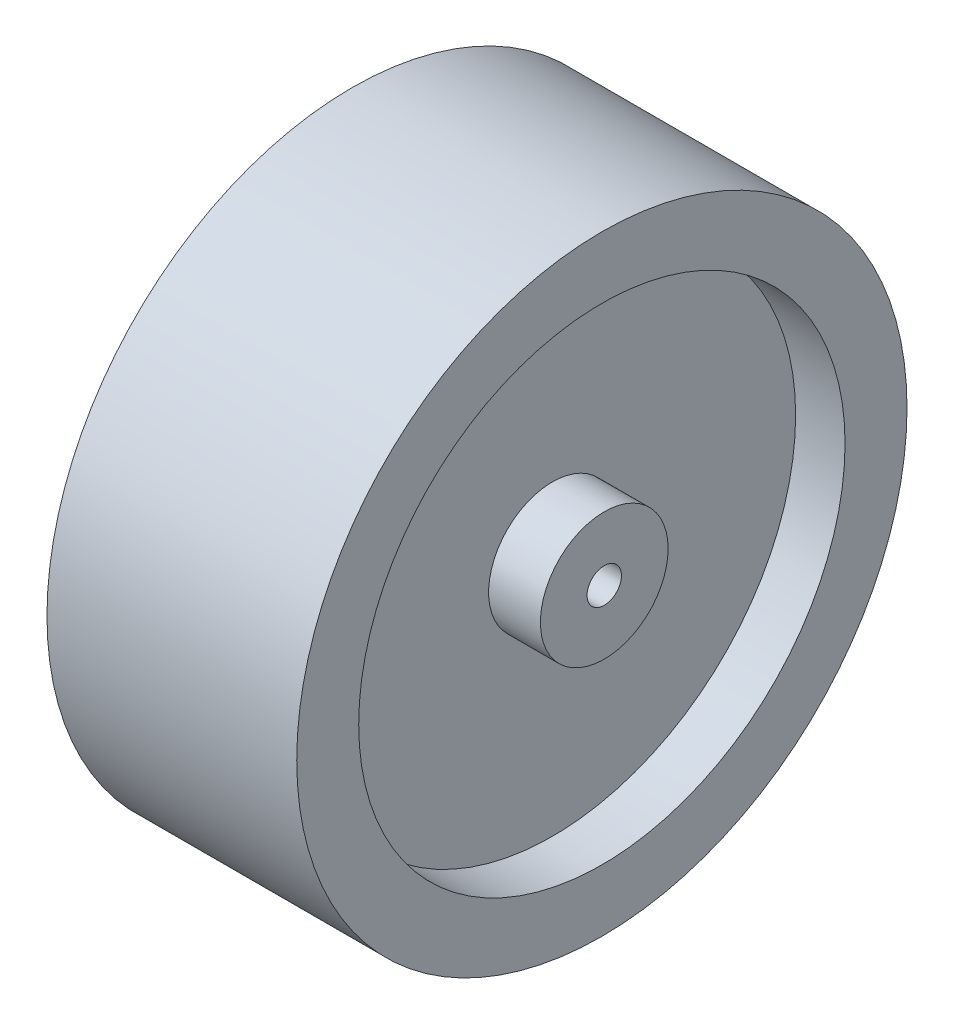
ISO-10303-21;
HEADER;
FILE_DESCRIPTION(('STEP AP214'),'2;1');
FILE_NAME('part.step','',(''),(''),'','','');
FILE_SCHEMA(('AUTOMOTIVE_DESIGN { 1 0 10303 214 1 1 1 1 }'));
ENDSEC;
DATA;
#1=APPLICATION_CONTEXT('core data for automotive mechanical design processes');
#2=APPLICATION_PROTOCOL_DEFINITION('international standard','automotive_design',2000,#1);
#3=PRODUCT_CONTEXT('',#1,'mechanical');
#4=PRODUCT('Part','Part','',(#3));
#5=PRODUCT_RELATED_PRODUCT_CATEGORY('part','',(#4));
#6=PRODUCT_DEFINITION_FORMATION('','',#4);
#7=PRODUCT_DEFINITION_CONTEXT('part definition',#1,'design');
#8=PRODUCT_DEFINITION('design','',#6,#7);
#9=PRODUCT_DEFINITION_SHAPE('','',#8);
#10=(LENGTH_UNIT() NAMED_UNIT(*) SI_UNIT(.MILLI.,.METRE.));
#11=(NAMED_UNIT(*) PLANE_ANGLE_UNIT() SI_UNIT($,.RADIAN.));
#12=(NAMED_UNIT(*) SI_UNIT($,.STERADIAN.) SOLID_ANGLE_UNIT());
#13=UNCERTAINTY_MEASURE_WITH_UNIT(LENGTH_MEASURE(1.E-05),#10,'distance_accuracy_value','');
#14=(GEOMETRIC_REPRESENTATION_CONTEXT(3) GLOBAL_UNCERTAINTY_ASSIGNED_CONTEXT((#13)) GLOBAL_UNIT_ASSIGNED_CONTEXT((#10,
#11,#12)) REPRESENTATION_CONTEXT('',''));
#15=CARTESIAN_POINT('',(0.,0.,0.));
#16=DIRECTION('',(0.,0.,1.));
#17=DIRECTION('',(1.,0.,0.));
#18=AXIS2_PLACEMENT_3D('',#15,#16,#17);
#19=CARTESIAN_POINT('',(20.7200849919368,0.,0.));
#20=DIRECTION('',(-1.,0.,0.));
#21=DIRECTION('',(0.,0.,1.));
#22=AXIS2_PLACEMENT_3D('',#19,#20,#21);
#23=CYLINDRICAL_SURFACE('',#22,16.64);
#24=CARTESIAN_POINT('',(20.7200849919368,0.,0.));
#25=DIRECTION('',(1.,0.,0.));
#26=DIRECTION('',(0.,0.,-1.));
#27=AXIS2_PLACEMENT_3D('',#24,#25,#26);
#28=CIRCLE('',#27,16.64);
#29=CARTESIAN_POINT('',(20.7200849919368,0.,-16.64));
#30=VERTEX_POINT('',#29);
#31=EDGE_CURVE('E10',#30,#30,#28,.T.);
#32=ORIENTED_EDGE('',*,*,#31,.F.);
#33=EDGE_LOOP('',(#32));
#34=FACE_BOUND('',#33,.T.);
#35=CARTESIAN_POINT('',(7.10088499193683,0.,0.));
#36=DIRECTION('',(1.,0.,0.));
#37=DIRECTION('',(0.,0.,-1.));
#38=AXIS2_PLACEMENT_3D('',#35,#36,#37);
#39=CIRCLE('',#38,16.64);
#40=CARTESIAN_POINT('',(7.10088499193683,0.,-16.64));
#41=VERTEX_POINT('',#40);
#42=EDGE_CURVE('E46',#41,#41,#39,.T.);
#43=ORIENTED_EDGE('',*,*,#42,.T.);
#44=EDGE_LOOP('',(#43));
#45=FACE_BOUND('',#44,.T.);
#46=ADVANCED_FACE('F38',(#34,#45),#23,.T.);
#47=CARTESIAN_POINT('',(20.7200849919368,0.,0.));
#48=DIRECTION('',(1.,0.,0.));
#49=DIRECTION('',(0.,0.,-1.));
#50=AXIS2_PLACEMENT_3D('',#47,#48,#49);
#51=PLANE('',#50);
#52=CARTESIAN_POINT('',(20.7200849919368,0.,0.));
#53=DIRECTION('',(1.,0.,0.));
#54=DIRECTION('',(0.,0.,-1.));
#55=AXIS2_PLACEMENT_3D('',#52,#53,#54);
#56=CIRCLE('',#55,13.2608);
#57=CARTESIAN_POINT('',(20.7200849919368,0.,-13.2608));
#58=VERTEX_POINT('',#57);
#59=EDGE_CURVE('E54',#58,#58,#56,.T.);
#60=ORIENTED_EDGE('',*,*,#59,.F.);
#61=EDGE_LOOP('',(#60));
#62=FACE_BOUND('',#61,.T.);
#63=ORIENTED_EDGE('',*,*,#31,.T.);
#64=EDGE_LOOP('',(#63));
#65=FACE_BOUND('',#64,.T.);
#66=ADVANCED_FACE('F107',(#62,#65),#51,.T.);
#67=CARTESIAN_POINT('',(7.10088499193683,0.,0.));
#68=DIRECTION('',(1.,0.,0.));
#69=DIRECTION('',(0.,0.,-1.));
#70=AXIS2_PLACEMENT_3D('',#67,#68,#69);
#71=PLANE('',#70);
#72=CARTESIAN_POINT('',(7.10088499193683,0.,0.));
#73=DIRECTION('',(-1.,0.,0.));
#74=DIRECTION('',(0.,0.,1.));
#75=AXIS2_PLACEMENT_3D('',#72,#73,#74);
#76=CIRCLE('',#75,13.2608);
#77=CARTESIAN_POINT('',(7.10088499193683,0.,13.2608));
#78=VERTEX_POINT('',#77);
#79=EDGE_CURVE('E62',#78,#78,#76,.T.);
#80=ORIENTED_EDGE('',*,*,#79,.F.);
#81=EDGE_LOOP('',(#80));
#82=FACE_BOUND('',#81,.T.);
#83=ORIENTED_EDGE('',*,*,#42,.F.);
#84=EDGE_LOOP('',(#83));
#85=FACE_BOUND('',#84,.T.);
#86=ADVANCED_FACE('F112',(#82,#85),#71,.F.);
#87=CARTESIAN_POINT('',(18.0249169919368,0.,0.));
#88=DIRECTION('',(1.,0.,0.));
#89=DIRECTION('',(0.,0.,-1.));
#90=AXIS2_PLACEMENT_3D('',#87,#88,#89);
#91=CYLINDRICAL_SURFACE('',#90,13.2608);
#92=CARTESIAN_POINT('',(18.0249169919368,0.,0.));
#93=DIRECTION('',(1.,0.,0.));
#94=DIRECTION('',(0.,0.,-1.));
#95=AXIS2_PLACEMENT_3D('',#92,#93,#94);
#96=CIRCLE('',#95,13.2608);
#97=CARTESIAN_POINT('',(18.0249169919368,0.,-13.2608));
#98=VERTEX_POINT('',#97);
#99=EDGE_CURVE('E52',#98,#98,#96,.T.);
#100=ORIENTED_EDGE('',*,*,#99,.F.);
#101=EDGE_LOOP('',(#100));
#102=FACE_BOUND('',#101,.T.);
#103=ORIENTED_EDGE('',*,*,#59,.T.);
#104=EDGE_LOOP('',(#103));
#105=FACE_BOUND('',#104,.T.);
#106=ADVANCED_FACE('F119',(#102,#105),#91,.F.);
#107=CARTESIAN_POINT('',(18.0249169919368,0.,0.));
#108=DIRECTION('',(1.,0.,0.));
#109=DIRECTION('',(0.,0.,-1.));
#110=AXIS2_PLACEMENT_3D('',#107,#108,#109);
#111=PLANE('',#110);
#112=CARTESIAN_POINT('',(18.0249169919368,0.,0.));
#113=DIRECTION('',(1.,0.,0.));
#114=DIRECTION('',(0.,0.,-1.));
#115=AXIS2_PLACEMENT_3D('',#112,#113,#114);
#116=CIRCLE('',#115,3.4816);
#117=CARTESIAN_POINT('',(18.0249169919368,0.,-3.4816));
#118=VERTEX_POINT('',#117);
#119=EDGE_CURVE('E78',#118,#118,#116,.T.);
#120=ORIENTED_EDGE('',*,*,#119,.F.);
#121=EDGE_LOOP('',(#120));
#122=FACE_BOUND('',#121,.T.);
#123=ORIENTED_EDGE('',*,*,#99,.T.);
#124=EDGE_LOOP('',(#123));
#125=FACE_BOUND('',#124,.T.);
#126=ADVANCED_FACE('F124',(#122,#125),#111,.T.);
#127=CARTESIAN_POINT('',(14.0876369919368,0.,0.));
#128=DIRECTION('',(-1.,0.,0.));
#129=DIRECTION('',(0.,0.,1.));
#130=AXIS2_PLACEMENT_3D('',#127,#128,#129);
#131=CYLINDRICAL_SURFACE('',#130,13.2608);
#132=CARTESIAN_POINT('',(14.0876369919368,0.,0.));
#133=DIRECTION('',(-1.,0.,0.));
#134=DIRECTION('',(0.,0.,1.));
#135=AXIS2_PLACEMENT_3D('',#132,#133,#134);
#136=CIRCLE('',#135,13.2608);
#137=CARTESIAN_POINT('',(14.0876369919368,0.,13.2608));
#138=VERTEX_POINT('',#137);
#139=EDGE_CURVE('E58',#138,#138,#136,.T.);
#140=CARTESIAN_POINT('',(14.0876369919368,0.,13.2608));
#141=CARTESIAN_POINT('',(14.0148583252702,0.,13.2608));
#142=CARTESIAN_POINT('',(13.9420796586035,0.,13.2608));
#143=CARTESIAN_POINT('',(13.7965223252702,0.,13.2608));
#144=CARTESIAN_POINT('',(13.7237436586035,0.,13.2608));
#145=CARTESIAN_POINT('',(13.5781863252702,0.,13.2608));
#146=CARTESIAN_POINT('',(13.5054076586035,0.,13.2608));
#147=CARTESIAN_POINT('',(13.3598503252702,0.,13.2608));
#148=CARTESIAN_POINT('',(13.2870716586035,0.,13.2608));
#149=CARTESIAN_POINT('',(13.1415143252702,0.,13.2608));
#150=CARTESIAN_POINT('',(13.0687356586035,0.,13.2608));
#151=CARTESIAN_POINT('',(12.9231783252702,0.,13.2608));
#152=CARTESIAN_POINT('',(12.8503996586035,0.,13.2608));
#153=CARTESIAN_POINT('',(12.7048423252702,0.,13.2608));
#154=CARTESIAN_POINT('',(12.6320636586035,0.,13.2608));
#155=CARTESIAN_POINT('',(12.4865063252702,0.,13.2608));
#156=CARTESIAN_POINT('',(12.4137276586035,0.,13.2608));
#157=CARTESIAN_POINT('',(12.2681703252702,0.,13.2608));
#158=CARTESIAN_POINT('',(12.1953916586035,0.,13.2608));
#159=CARTESIAN_POINT('',(12.0498343252702,0.,13.2608));
#160=CARTESIAN_POINT('',(11.9770556586035,0.,13.2608));
#161=CARTESIAN_POINT('',(11.8314983252702,0.,13.2608));
#162=CARTESIAN_POINT('',(11.7587196586035,0.,13.2608));
#163=CARTESIAN_POINT('',(11.6131623252702,0.,13.2608));
#164=CARTESIAN_POINT('',(11.5403836586035,0.,13.2608));
#165=CARTESIAN_POINT('',(11.3948263252702,0.,13.2608));
#166=CARTESIAN_POINT('',(11.3220476586035,0.,13.2608));
#167=CARTESIAN_POINT('',(11.1764903252702,0.,13.2608));
#168=CARTESIAN_POINT('',(11.1037116586035,0.,13.2608));
#169=CARTESIAN_POINT('',(10.9581543252702,0.,13.2608));
#170=CARTESIAN_POINT('',(10.8853756586035,0.,13.2608));
#171=CARTESIAN_POINT('',(10.7398183252702,0.,13.2608));
#172=CARTESIAN_POINT('',(10.6670396586035,0.,13.2608));
#173=CARTESIAN_POINT('',(10.5214823252702,0.,13.2608));
#174=CARTESIAN_POINT('',(10.4487036586035,0.,13.2608));
#175=CARTESIAN_POINT('',(10.3031463252702,0.,13.2608));
#176=CARTESIAN_POINT('',(10.2303676586035,0.,13.2608));
#177=CARTESIAN_POINT('',(10.0848103252702,0.,13.2608));
#178=CARTESIAN_POINT('',(10.0120316586035,0.,13.2608));
#179=CARTESIAN_POINT('',(9.86647432527017,0.,13.2608));
#180=CARTESIAN_POINT('',(9.7936956586035,0.,13.2608));
#181=CARTESIAN_POINT('',(9.64813832527017,0.,13.2608));
#182=CARTESIAN_POINT('',(9.5753596586035,0.,13.2608));
#183=CARTESIAN_POINT('',(9.42980232527017,0.,13.2608));
#184=CARTESIAN_POINT('',(9.3570236586035,0.,13.2608));
#185=CARTESIAN_POINT('',(9.21146632527016,0.,13.2608));
#186=CARTESIAN_POINT('',(9.1386876586035,0.,13.2608));
#187=CARTESIAN_POINT('',(8.99313032527017,0.,13.2608));
#188=CARTESIAN_POINT('',(8.9203516586035,0.,13.2608));
#189=CARTESIAN_POINT('',(8.77479432527017,0.,13.2608));
#190=CARTESIAN_POINT('',(8.7020156586035,0.,13.2608));
#191=CARTESIAN_POINT('',(8.55645832527017,0.,13.2608));
#192=CARTESIAN_POINT('',(8.4836796586035,0.,13.2608));
#193=CARTESIAN_POINT('',(8.33812232527016,0.,13.2608));
#194=CARTESIAN_POINT('',(8.2653436586035,0.,13.2608));
#195=CARTESIAN_POINT('',(8.11978632527016,0.,13.2608));
#196=CARTESIAN_POINT('',(8.0470076586035,0.,13.2608));
#197=CARTESIAN_POINT('',(7.90145032527016,0.,13.2608));
#198=CARTESIAN_POINT('',(7.8286716586035,0.,13.2608));
#199=CARTESIAN_POINT('',(7.68311432527016,0.,13.2608));
#200=CARTESIAN_POINT('',(7.6103356586035,0.,13.2608));
#201=CARTESIAN_POINT('',(7.46477832527016,0.,13.2608));
#202=CARTESIAN_POINT('',(7.3919996586035,0.,13.2608));
#203=CARTESIAN_POINT('',(7.24644232527016,0.,13.2608));
#204=CARTESIAN_POINT('',(7.1736636586035,0.,13.2608));
#205=CARTESIAN_POINT('',(7.10088499193683,0.,13.2608));
#206=B_SPLINE_CURVE_WITH_KNOTS('',3,(#140,#141,#142,#143,#144,#145,#146,#147,#148,#149,#150,
#151,#152,#153,#154,#155,#156,#157,#158,#159,#160,#161,#162,#163,#164,#165,#166,#167,#168,#169,
#170,#171,#172,#173,#174,#175,#176,#177,#178,#179,#180,#181,#182,#183,#184,#185,#186,#187,#188,
#189,#190,#191,#192,#193,#194,#195,#196,#197,#198,#199,#200,#201,#202,#203,#204,#205),
.UNSPECIFIED.,.F.,.F.,(4,2,2,2,2,2,2,2,2,2,2,2,2,2,2,2,2,2,2,2,2,2,2,2,2,2,2,2,2,2,2,2,4),(0.,
0.218336000000001,0.436672000000001,0.655008000000002,0.873344000000002,1.09168,1.310016,
1.528352,1.746688,1.965024,2.18336,2.401696,2.620032,2.838368,3.056704,3.27504,3.493376,
3.71171200000001,3.93004800000001,4.14838400000001,4.36672,4.58505600000001,4.80339200000001,
5.02172800000001,5.24006400000001,5.45840000000001,5.67673600000001,5.89507200000001,
6.11340800000001,6.33174400000001,6.55008000000001,6.76841600000001,6.98675200000001),.UNSPECIFIED.);
#207=EDGE_CURVE('BSEAM131',#138,#78,#206,.T.);
#208=ORIENTED_EDGE('',*,*,#139,.F.);
#209=ORIENTED_EDGE('',*,*,#79,.T.);
#210=ORIENTED_EDGE('',*,*,#207,.T.);
#211=ORIENTED_EDGE('',*,*,#207,.F.);
#212=EDGE_LOOP('',(#208,#210,#209,#211));
#213=FACE_BOUND('',#212,.T.);
#214=ADVANCED_FACE('F131',(#213),#131,.F.);
#215=CARTESIAN_POINT('',(14.0876369919368,0.,0.));
#216=DIRECTION('',(-1.,0.,0.));
#217=DIRECTION('',(0.,0.,1.));
#218=AXIS2_PLACEMENT_3D('',#215,#216,#217);
#219=PLANE('',#218);
#220=CARTESIAN_POINT('',(14.0876369919368,0.,0.));
#221=DIRECTION('',(-1.,0.,0.));
#222=DIRECTION('',(0.,0.,1.));
#223=AXIS2_PLACEMENT_3D('',#220,#221,#222);
#224=CIRCLE('',#223,3.4816);
#225=CARTESIAN_POINT('',(14.0876369919368,0.,-3.4816));
#226=VERTEX_POINT('',#225);
#227=EDGE_CURVE('E70',#226,#226,#224,.T.);
#228=ORIENTED_EDGE('',*,*,#227,.F.);
#229=EDGE_LOOP('',(#228));
#230=FACE_BOUND('',#229,.T.);
#231=ORIENTED_EDGE('',*,*,#139,.T.);
#232=EDGE_LOOP('',(#231));
#233=FACE_BOUND('',#232,.T.);
#234=ADVANCED_FACE('F135',(#230,#233),#219,.T.);
#235=CARTESIAN_POINT('',(7.10088499193683,0.,0.));
#236=DIRECTION('',(1.,0.,0.));
#237=DIRECTION('',(0.,0.,-1.));
#238=AXIS2_PLACEMENT_3D('',#235,#236,#237);
#239=CYLINDRICAL_SURFACE('',#238,3.4816);
#240=CARTESIAN_POINT('',(7.10088499193683,0.,0.));
#241=DIRECTION('',(-1.,0.,0.));
#242=DIRECTION('',(0.,0.,1.));
#243=AXIS2_PLACEMENT_3D('',#240,#241,#242);
#244=CIRCLE('',#243,3.4816);
#245=CARTESIAN_POINT('',(7.10088499193683,0.,-3.4816));
#246=VERTEX_POINT('',#245);
#247=EDGE_CURVE('E66',#246,#246,#244,.T.);
#248=CARTESIAN_POINT('',(7.10088499193683,0.,-3.4816));
#249=CARTESIAN_POINT('',(7.1736636586035,0.,-3.4816));
#250=CARTESIAN_POINT('',(7.24644232527016,0.,-3.4816));
#251=CARTESIAN_POINT('',(7.3919996586035,0.,-3.4816));
#252=CARTESIAN_POINT('',(7.46477832527016,0.,-3.4816));
#253=CARTESIAN_POINT('',(7.6103356586035,0.,-3.4816));
#254=CARTESIAN_POINT('',(7.68311432527016,0.,-3.4816));
#255=CARTESIAN_POINT('',(7.8286716586035,0.,-3.4816));
#256=CARTESIAN_POINT('',(7.90145032527016,0.,-3.4816));
#257=CARTESIAN_POINT('',(8.0470076586035,0.,-3.4816));
#258=CARTESIAN_POINT('',(8.11978632527016,0.,-3.4816));
#259=CARTESIAN_POINT('',(8.2653436586035,0.,-3.4816));
#260=CARTESIAN_POINT('',(8.33812232527016,0.,-3.4816));
#261=CARTESIAN_POINT('',(8.4836796586035,0.,-3.4816));
#262=CARTESIAN_POINT('',(8.55645832527016,0.,-3.4816));
#263=CARTESIAN_POINT('',(8.7020156586035,0.,-3.4816));
#264=CARTESIAN_POINT('',(8.77479432527017,0.,-3.4816));
#265=CARTESIAN_POINT('',(8.9203516586035,0.,-3.4816));
#266=CARTESIAN_POINT('',(8.99313032527017,0.,-3.4816));
#267=CARTESIAN_POINT('',(9.1386876586035,0.,-3.4816));
#268=CARTESIAN_POINT('',(9.21146632527016,0.,-3.4816));
#269=CARTESIAN_POINT('',(9.3570236586035,0.,-3.4816));
#270=CARTESIAN_POINT('',(9.42980232527017,0.,-3.4816));
#271=CARTESIAN_POINT('',(9.5753596586035,0.,-3.4816));
#272=CARTESIAN_POINT('',(9.64813832527017,0.,-3.4816));
#273=CARTESIAN_POINT('',(9.7936956586035,0.,-3.4816));
#274=CARTESIAN_POINT('',(9.86647432527017,0.,-3.4816));
#275=CARTESIAN_POINT('',(10.0120316586035,0.,-3.4816));
#276=CARTESIAN_POINT('',(10.0848103252702,0.,-3.4816));
#277=CARTESIAN_POINT('',(10.2303676586035,0.,-3.4816));
#278=CARTESIAN_POINT('',(10.3031463252702,0.,-3.4816));
#279=CARTESIAN_POINT('',(10.4487036586035,0.,-3.4816));
#280=CARTESIAN_POINT('',(10.5214823252702,0.,-3.4816));
#281=CARTESIAN_POINT('',(10.6670396586035,0.,-3.4816));
#282=CARTESIAN_POINT('',(10.7398183252702,0.,-3.4816));
#283=CARTESIAN_POINT('',(10.8853756586035,0.,-3.4816));
#284=CARTESIAN_POINT('',(10.9581543252702,0.,-3.4816));
#285=CARTESIAN_POINT('',(11.1037116586035,0.,-3.4816));
#286=CARTESIAN_POINT('',(11.1764903252702,0.,-3.4816));
#287=CARTESIAN_POINT('',(11.3220476586035,0.,-3.4816));
#288=CARTESIAN_POINT('',(11.3948263252702,0.,-3.4816));
#289=CARTESIAN_POINT('',(11.5403836586035,0.,-3.4816));
#290=CARTESIAN_POINT('',(11.6131623252702,0.,-3.4816));
#291=CARTESIAN_POINT('',(11.7587196586035,0.,-3.4816));
#292=CARTESIAN_POINT('',(11.8314983252702,0.,-3.4816));
#293=CARTESIAN_POINT('',(11.9770556586035,0.,-3.4816));
#294=CARTESIAN_POINT('',(12.0498343252702,0.,-3.4816));
#295=CARTESIAN_POINT('',(12.1953916586035,0.,-3.4816));
#296=CARTESIAN_POINT('',(12.2681703252702,0.,-3.4816));
#297=CARTESIAN_POINT('',(12.4137276586035,0.,-3.4816));
#298=CARTESIAN_POINT('',(12.4865063252702,0.,-3.4816));
#299=CARTESIAN_POINT('',(12.6320636586035,0.,-3.4816));
#300=CARTESIAN_POINT('',(12.7048423252702,0.,-3.4816));
#301=CARTESIAN_POINT('',(12.8503996586035,0.,-3.4816));
#302=CARTESIAN_POINT('',(12.9231783252702,0.,-3.4816));
#303=CARTESIAN_POINT('',(13.0687356586035,0.,-3.4816));
#304=CARTESIAN_POINT('',(13.1415143252702,0.,-3.4816));
#305=CARTESIAN_POINT('',(13.2870716586035,0.,-3.4816));
#306=CARTESIAN_POINT('',(13.3598503252702,0.,-3.4816));
#307=CARTESIAN_POINT('',(13.5054076586035,0.,-3.4816));
#308=CARTESIAN_POINT('',(13.5781863252702,0.,-3.4816));
#309=CARTESIAN_POINT('',(13.7237436586035,0.,-3.4816));
#310=CARTESIAN_POINT('',(13.7965223252702,0.,-3.4816));
#311=CARTESIAN_POINT('',(13.9420796586035,0.,-3.4816));
#312=CARTESIAN_POINT('',(14.0148583252702,0.,-3.4816));
#313=CARTESIAN_POINT('',(14.0876369919368,0.,-3.4816));
#314=B_SPLINE_CURVE_WITH_KNOTS('',3,(#248,#249,#250,#251,#252,#253,#254,#255,#256,#257,#258,
#259,#260,#261,#262,#263,#264,#265,#266,#267,#268,#269,#270,#271,#272,#273,#274,#275,#276,#277,
#278,#279,#280,#281,#282,#283,#284,#285,#286,#287,#288,#289,#290,#291,#292,#293,#294,#295,#296,
#297,#298,#299,#300,#301,#302,#303,#304,#305,#306,#307,#308,#309,#310,#311,#312,#313),
.UNSPECIFIED.,.F.,.F.,(4,2,2,2,2,2,2,2,2,2,2,2,2,2,2,2,2,2,2,2,2,2,2,2,2,2,2,2,2,2,2,2,4),(0.,
0.218336,0.436672000000001,0.655008000000001,0.873344000000002,1.09168,1.310016,1.528352,
1.746688,1.965024,2.18336,2.401696,2.620032,2.838368,3.056704,3.27504,3.493376,3.71171200000001,
3.93004800000001,4.14838400000001,4.36672,4.585056,4.803392,5.02172800000001,5.24006400000001,
5.45840000000001,5.67673600000001,5.89507200000001,6.11340800000001,6.33174400000001,
6.55008000000001,6.76841600000001,6.98675200000001),.UNSPECIFIED.);
#315=EDGE_CURVE('BSEAM139',#246,#226,#314,.T.);
#316=ORIENTED_EDGE('',*,*,#247,.F.);
#317=ORIENTED_EDGE('',*,*,#227,.T.);
#318=ORIENTED_EDGE('',*,*,#315,.T.);
#319=ORIENTED_EDGE('',*,*,#315,.F.);
#320=EDGE_LOOP('',(#316,#318,#317,#319));
#321=FACE_BOUND('',#320,.T.);
#322=ADVANCED_FACE('F139',(#321),#239,.T.);
#323=CARTESIAN_POINT('',(7.10088499193683,0.,0.));
#324=DIRECTION('',(-1.,0.,0.));
#325=DIRECTION('',(0.,0.,1.));
#326=AXIS2_PLACEMENT_3D('',#323,#324,#325);
#327=PLANE('',#326);
#328=CARTESIAN_POINT('',(7.10088499193683,0.,0.));
#329=DIRECTION('',(-1.,0.,0.));
#330=DIRECTION('',(0.,0.,1.));
#331=AXIS2_PLACEMENT_3D('',#328,#329,#330);
#332=CIRCLE('',#331,0.93696);
#333=CARTESIAN_POINT('',(7.10088499193683,0.,0.936960000000001));
#334=VERTEX_POINT('',#333);
#335=EDGE_CURVE('E82',#334,#334,#332,.F.);
#336=ORIENTED_EDGE('',*,*,#335,.T.);
#337=EDGE_LOOP('',(#336));
#338=FACE_BOUND('',#337,.T.);
#339=ORIENTED_EDGE('',*,*,#247,.T.);
#340=EDGE_LOOP('',(#339));
#341=FACE_BOUND('',#340,.T.);
#342=ADVANCED_FACE('F143',(#338,#341),#327,.T.);
#343=CARTESIAN_POINT('',(20.8501329919368,0.,0.));
#344=DIRECTION('',(-1.,0.,0.));
#345=DIRECTION('',(0.,0.,1.));
#346=AXIS2_PLACEMENT_3D('',#343,#344,#345);
#347=CYLINDRICAL_SURFACE('',#346,3.4816);
#348=CARTESIAN_POINT('',(20.8501329919368,0.,0.));
#349=DIRECTION('',(1.,0.,0.));
#350=DIRECTION('',(0.,0.,-1.));
#351=AXIS2_PLACEMENT_3D('',#348,#349,#350);
#352=CIRCLE('',#351,3.4816);
#353=CARTESIAN_POINT('',(20.8501329919368,0.,-3.4816));
#354=VERTEX_POINT('',#353);
#355=EDGE_CURVE('E74',#354,#354,#352,.T.);
#356=ORIENTED_EDGE('',*,*,#355,.F.);
#357=EDGE_LOOP('',(#356));
#358=FACE_BOUND('',#357,.T.);
#359=ORIENTED_EDGE('',*,*,#119,.T.);
#360=EDGE_LOOP('',(#359));
#361=FACE_BOUND('',#360,.T.);
#362=ADVANCED_FACE('F104',(#358,#361),#347,.T.);
#363=CARTESIAN_POINT('',(20.8501329919368,0.,0.));
#364=DIRECTION('',(1.,0.,0.));
#365=DIRECTION('',(0.,0.,-1.));
#366=AXIS2_PLACEMENT_3D('',#363,#364,#365);
#367=PLANE('',#366);
#368=CARTESIAN_POINT('',(20.8501329919368,0.,0.));
#369=DIRECTION('',(1.,0.,0.));
#370=DIRECTION('',(0.,0.,-1.));
#371=AXIS2_PLACEMENT_3D('',#368,#369,#370);
#372=CIRCLE('',#371,0.93696);
#373=CARTESIAN_POINT('',(20.8501329919368,0.,-0.936959999999999));
#374=VERTEX_POINT('',#373);
#375=EDGE_CURVE('E41',#374,#374,#372,.F.);
#376=ORIENTED_EDGE('',*,*,#375,.T.);
#377=EDGE_LOOP('',(#376));
#378=FACE_BOUND('',#377,.T.);
#379=ORIENTED_EDGE('',*,*,#355,.T.);
#380=EDGE_LOOP('',(#379));
#381=FACE_BOUND('',#380,.T.);
#382=ADVANCED_FACE('F94',(#378,#381),#367,.T.);
#383=CARTESIAN_POINT('',(35.5455569919368,0.,0.));
#384=DIRECTION('',(-1.,0.,0.));
#385=DIRECTION('',(0.,0.,1.));
#386=AXIS2_PLACEMENT_3D('',#383,#384,#385);
#387=CYLINDRICAL_SURFACE('',#386,0.93696);
#388=ORIENTED_EDGE('',*,*,#335,.F.);
#389=EDGE_LOOP('',(#388));
#390=FACE_BOUND('',#389,.T.);
#391=ORIENTED_EDGE('',*,*,#375,.F.);
#392=EDGE_LOOP('',(#391));
#393=FACE_BOUND('',#392,.T.);
#394=ADVANCED_FACE('F97',(#390,#393),#387,.F.);
#395=CLOSED_SHELL('',(#46,#66,#86,#106,#126,#214,#234,#322,#342,#362,#382,#394));
#396=MANIFOLD_SOLID_BREP('B2',#395);
#397=ADVANCED_BREP_SHAPE_REPRESENTATION('',(#18,#396),#14);
#398=SHAPE_DEFINITION_REPRESENTATION(#9,#397);
ENDSEC;
END-ISO-10303-21;
